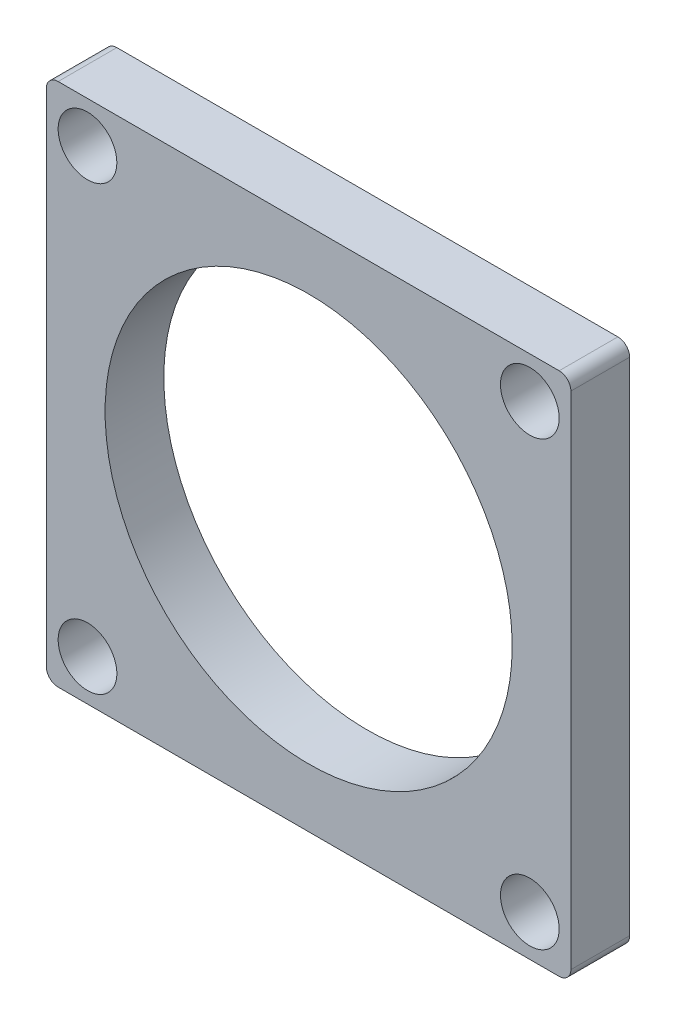
ISO-10303-21;
HEADER;
FILE_DESCRIPTION(('STEP AP214'),'2;1');
FILE_NAME('part.step','',(''),(''),'','','');
FILE_SCHEMA(('AUTOMOTIVE_DESIGN { 1 0 10303 214 1 1 1 1 }'));
ENDSEC;
DATA;
#1=APPLICATION_CONTEXT('core data for automotive mechanical design processes');
#2=APPLICATION_PROTOCOL_DEFINITION('international standard','automotive_design',2000,#1);
#3=PRODUCT_CONTEXT('',#1,'mechanical');
#4=PRODUCT('Part','Part','',(#3));
#5=PRODUCT_RELATED_PRODUCT_CATEGORY('part','',(#4));
#6=PRODUCT_DEFINITION_FORMATION('','',#4);
#7=PRODUCT_DEFINITION_CONTEXT('part definition',#1,'design');
#8=PRODUCT_DEFINITION('design','',#6,#7);
#9=PRODUCT_DEFINITION_SHAPE('','',#8);
#10=(LENGTH_UNIT() NAMED_UNIT(*) SI_UNIT(.MILLI.,.METRE.));
#11=(NAMED_UNIT(*) PLANE_ANGLE_UNIT() SI_UNIT($,.RADIAN.));
#12=(NAMED_UNIT(*) SI_UNIT($,.STERADIAN.) SOLID_ANGLE_UNIT());
#13=UNCERTAINTY_MEASURE_WITH_UNIT(LENGTH_MEASURE(1.E-05),#10,'distance_accuracy_value','');
#14=(GEOMETRIC_REPRESENTATION_CONTEXT(3) GLOBAL_UNCERTAINTY_ASSIGNED_CONTEXT((#13)) GLOBAL_UNIT_ASSIGNED_CONTEXT((#10,
#11,#12)) REPRESENTATION_CONTEXT('',''));
#15=CARTESIAN_POINT('',(0.,0.,0.));
#16=DIRECTION('',(0.,0.,1.));
#17=DIRECTION('',(1.,0.,0.));
#18=AXIS2_PLACEMENT_3D('',#15,#16,#17);
#19=CARTESIAN_POINT('',(-44.67,-44.67,10.));
#20=DIRECTION('',(0.,1.,0.));
#21=DIRECTION('',(-1.,0.,0.));
#22=AXIS2_PLACEMENT_3D('',#19,#20,#21);
#23=PLANE('',#22);
#24=DIRECTION('',(1.,0.,0.));
#25=VECTOR('',#24,1.);
#26=CARTESIAN_POINT('',(-44.67,-44.67,10.));
#27=LINE('',#26,#25);
#28=CARTESIAN_POINT('',(-42.67,-44.67,10.));
#29=VERTEX_POINT('',#28);
#30=CARTESIAN_POINT('',(42.6700000000005,-44.6699999999995,10.));
#31=VERTEX_POINT('',#30);
#32=EDGE_CURVE('E125',#29,#31,#27,.T.);
#33=ORIENTED_EDGE('',*,*,#32,.F.);
#34=DIRECTION('',(0.,0.,-1.));
#35=VECTOR('',#34,1.);
#36=CARTESIAN_POINT('',(-42.67,-44.67,0.));
#37=LINE('',#36,#35);
#38=CARTESIAN_POINT('',(-42.67,-44.67,0.));
#39=VERTEX_POINT('',#38);
#40=EDGE_CURVE('E155',#29,#39,#37,.T.);
#41=ORIENTED_EDGE('',*,*,#40,.T.);
#42=DIRECTION('',(1.,0.,0.));
#43=VECTOR('',#42,1.);
#44=CARTESIAN_POINT('',(-44.67,-44.67,0.));
#45=LINE('',#44,#43);
#46=CARTESIAN_POINT('',(42.6700000000005,-44.6699999999995,0.));
#47=VERTEX_POINT('',#46);
#48=EDGE_CURVE('E109',#39,#47,#45,.T.);
#49=ORIENTED_EDGE('',*,*,#48,.T.);
#50=DIRECTION('',(0.,0.,-1.));
#51=VECTOR('',#50,1.);
#52=CARTESIAN_POINT('',(42.6700000000006,-44.6699999999995,10.));
#53=LINE('',#52,#51);
#54=EDGE_CURVE('E153',#47,#31,#53,.F.);
#55=ORIENTED_EDGE('',*,*,#54,.T.);
#56=EDGE_LOOP('',(#33,#41,#49,#55));
#57=FACE_BOUND('',#56,.T.);
#58=ADVANCED_FACE('F38',(#57),#23,.F.);
#59=CARTESIAN_POINT('',(44.6700000000006,-44.6699999999994,10.));
#60=DIRECTION('',(-1.,0.,0.));
#61=DIRECTION('',(0.,0.,1.));
#62=AXIS2_PLACEMENT_3D('',#59,#60,#61);
#63=PLANE('',#62);
#64=DIRECTION('',(0.,1.,0.));
#65=VECTOR('',#64,1.);
#66=CARTESIAN_POINT('',(44.6700000000006,-44.6699999999994,10.));
#67=LINE('',#66,#65);
#68=CARTESIAN_POINT('',(44.6700000000006,-42.6699999999995,10.));
#69=VERTEX_POINT('',#68);
#70=CARTESIAN_POINT('',(44.6700000000006,42.6699999999995,10.));
#71=VERTEX_POINT('',#70);
#72=EDGE_CURVE('E159',#69,#71,#67,.T.);
#73=ORIENTED_EDGE('',*,*,#72,.F.);
#74=DIRECTION('',(0.,0.,-1.));
#75=VECTOR('',#74,1.);
#76=CARTESIAN_POINT('',(44.6700000000006,-42.6699999999995,10.));
#77=LINE('',#76,#75);
#78=CARTESIAN_POINT('',(44.6700000000006,-42.6699999999995,0.));
#79=VERTEX_POINT('',#78);
#80=EDGE_CURVE('E11',#69,#79,#77,.T.);
#81=ORIENTED_EDGE('',*,*,#80,.T.);
#82=DIRECTION('',(0.,1.,0.));
#83=VECTOR('',#82,1.);
#84=CARTESIAN_POINT('',(44.6700000000006,-44.6699999999994,0.));
#85=LINE('',#84,#83);
#86=CARTESIAN_POINT('',(44.6700000000006,42.6699999999995,0.));
#87=VERTEX_POINT('',#86);
#88=EDGE_CURVE('E169',#79,#87,#85,.T.);
#89=ORIENTED_EDGE('',*,*,#88,.T.);
#90=DIRECTION('',(0.,0.,-1.));
#91=VECTOR('',#90,1.);
#92=CARTESIAN_POINT('',(44.6700000000006,42.6699999999995,10.));
#93=LINE('',#92,#91);
#94=EDGE_CURVE('E46',#87,#71,#93,.F.);
#95=ORIENTED_EDGE('',*,*,#94,.T.);
#96=EDGE_LOOP('',(#73,#81,#89,#95));
#97=FACE_BOUND('',#96,.T.);
#98=ADVANCED_FACE('F192',(#97),#63,.F.);
#99=CARTESIAN_POINT('',(-44.67,44.67,10.));
#100=DIRECTION('',(0.,1.,0.));
#101=DIRECTION('',(-1.,0.,0.));
#102=AXIS2_PLACEMENT_3D('',#99,#100,#101);
#103=PLANE('',#102);
#104=DIRECTION('',(1.,0.,0.));
#105=VECTOR('',#104,1.);
#106=CARTESIAN_POINT('',(-44.67,44.67,0.));
#107=LINE('',#106,#105);
#108=CARTESIAN_POINT('',(-42.67,44.67,0.));
#109=VERTEX_POINT('',#108);
#110=CARTESIAN_POINT('',(42.6700000000005,44.6699999999995,0.));
#111=VERTEX_POINT('',#110);
#112=EDGE_CURVE('E126',#109,#111,#107,.T.);
#113=ORIENTED_EDGE('',*,*,#112,.F.);
#114=DIRECTION('',(0.,0.,-1.));
#115=VECTOR('',#114,1.);
#116=CARTESIAN_POINT('',(-42.67,44.67,10.));
#117=LINE('',#116,#115);
#118=CARTESIAN_POINT('',(-42.67,44.67,10.));
#119=VERTEX_POINT('',#118);
#120=EDGE_CURVE('E145',#109,#119,#117,.F.);
#121=ORIENTED_EDGE('',*,*,#120,.T.);
#122=DIRECTION('',(1.,0.,0.));
#123=VECTOR('',#122,1.);
#124=CARTESIAN_POINT('',(-44.67,44.67,10.));
#125=LINE('',#124,#123);
#126=CARTESIAN_POINT('',(42.6700000000005,44.6699999999995,10.));
#127=VERTEX_POINT('',#126);
#128=EDGE_CURVE('E135',#119,#127,#125,.T.);
#129=ORIENTED_EDGE('',*,*,#128,.T.);
#130=DIRECTION('',(0.,0.,-1.));
#131=VECTOR('',#130,1.);
#132=CARTESIAN_POINT('',(42.6700000000006,44.6699999999995,0.));
#133=LINE('',#132,#131);
#134=EDGE_CURVE('E142',#127,#111,#133,.T.);
#135=ORIENTED_EDGE('',*,*,#134,.T.);
#136=EDGE_LOOP('',(#113,#121,#129,#135));
#137=FACE_BOUND('',#136,.T.);
#138=ADVANCED_FACE('F176',(#137),#103,.T.);
#139=CARTESIAN_POINT('',(-44.67,-44.67,10.));
#140=DIRECTION('',(-1.,0.,0.));
#141=DIRECTION('',(0.,0.,1.));
#142=AXIS2_PLACEMENT_3D('',#139,#140,#141);
#143=PLANE('',#142);
#144=DIRECTION('',(0.,1.,0.));
#145=VECTOR('',#144,1.);
#146=CARTESIAN_POINT('',(-44.67,-44.67,10.));
#147=LINE('',#146,#145);
#148=CARTESIAN_POINT('',(-44.67,-42.67,10.));
#149=VERTEX_POINT('',#148);
#150=CARTESIAN_POINT('',(-44.67,42.67,10.));
#151=VERTEX_POINT('',#150);
#152=EDGE_CURVE('E131',#149,#151,#147,.T.);
#153=ORIENTED_EDGE('',*,*,#152,.T.);
#154=DIRECTION('',(0.,0.,-1.));
#155=VECTOR('',#154,1.);
#156=CARTESIAN_POINT('',(-44.67,42.67,10.));
#157=LINE('',#156,#155);
#158=CARTESIAN_POINT('',(-44.67,42.67,0.));
#159=VERTEX_POINT('',#158);
#160=EDGE_CURVE('E124',#151,#159,#157,.T.);
#161=ORIENTED_EDGE('',*,*,#160,.T.);
#162=DIRECTION('',(0.,1.,0.));
#163=VECTOR('',#162,1.);
#164=CARTESIAN_POINT('',(-44.67,-44.67,0.));
#165=LINE('',#164,#163);
#166=CARTESIAN_POINT('',(-44.67,-42.67,0.));
#167=VERTEX_POINT('',#166);
#168=EDGE_CURVE('E107',#167,#159,#165,.T.);
#169=ORIENTED_EDGE('',*,*,#168,.F.);
#170=DIRECTION('',(0.,0.,-1.));
#171=VECTOR('',#170,1.);
#172=CARTESIAN_POINT('',(-44.67,-42.67,10.));
#173=LINE('',#172,#171);
#174=EDGE_CURVE('E121',#167,#149,#173,.F.);
#175=ORIENTED_EDGE('',*,*,#174,.T.);
#176=EDGE_LOOP('',(#153,#161,#169,#175));
#177=FACE_BOUND('',#176,.T.);
#178=ADVANCED_FACE('F120',(#177),#143,.T.);
#179=CARTESIAN_POINT('',(0.,0.,10.));
#180=DIRECTION('',(0.,0.,1.));
#181=DIRECTION('',(1.,0.,0.));
#182=AXIS2_PLACEMENT_3D('',#179,#180,#181);
#183=PLANE('',#182);
#184=CARTESIAN_POINT('',(37.6700000000006,37.67,10.));
#185=DIRECTION('',(0.,0.,1.));
#186=DIRECTION('',(-1.,0.,0.));
#187=AXIS2_PLACEMENT_3D('',#184,#185,#186);
#188=CIRCLE('',#187,5.);
#189=CARTESIAN_POINT('',(32.6700000000006,37.67,10.));
#190=VERTEX_POINT('',#189);
#191=EDGE_CURVE('E323',#190,#190,#188,.T.);
#192=ORIENTED_EDGE('',*,*,#191,.F.);
#193=EDGE_LOOP('',(#192));
#194=FACE_BOUND('',#193,.T.);
#195=CARTESIAN_POINT('',(-37.6700000000006,37.67,10.));
#196=DIRECTION('',(0.,0.,1.));
#197=DIRECTION('',(1.,0.,0.));
#198=AXIS2_PLACEMENT_3D('',#195,#196,#197);
#199=CIRCLE('',#198,5.);
#200=CARTESIAN_POINT('',(-32.6700000000006,37.67,10.));
#201=VERTEX_POINT('',#200);
#202=EDGE_CURVE('E327',#201,#201,#199,.T.);
#203=ORIENTED_EDGE('',*,*,#202,.F.);
#204=EDGE_LOOP('',(#203));
#205=FACE_BOUND('',#204,.T.);
#206=CARTESIAN_POINT('',(-37.6700000000006,-37.67,10.));
#207=DIRECTION('',(0.,0.,1.));
#208=DIRECTION('',(-1.,0.,0.));
#209=AXIS2_PLACEMENT_3D('',#206,#207,#208);
#210=CIRCLE('',#209,5.);
#211=CARTESIAN_POINT('',(-42.6700000000006,-37.67,10.));
#212=VERTEX_POINT('',#211);
#213=EDGE_CURVE('E331',#212,#212,#210,.T.);
#214=ORIENTED_EDGE('',*,*,#213,.F.);
#215=EDGE_LOOP('',(#214));
#216=FACE_BOUND('',#215,.T.);
#217=CARTESIAN_POINT('',(37.6700000000006,-37.67,10.));
#218=DIRECTION('',(0.,0.,1.));
#219=DIRECTION('',(1.,0.,0.));
#220=AXIS2_PLACEMENT_3D('',#217,#218,#219);
#221=CIRCLE('',#220,5.);
#222=CARTESIAN_POINT('',(42.6700000000006,-37.67,10.));
#223=VERTEX_POINT('',#222);
#224=EDGE_CURVE('E335',#223,#223,#221,.T.);
#225=ORIENTED_EDGE('',*,*,#224,.F.);
#226=EDGE_LOOP('',(#225));
#227=FACE_BOUND('',#226,.T.);
#228=CARTESIAN_POINT('',(0.,0.,10.));
#229=DIRECTION('',(0.,0.,1.));
#230=DIRECTION('',(1.,0.,0.));
#231=AXIS2_PLACEMENT_3D('',#228,#229,#230);
#232=CIRCLE('',#231,34.67);
#233=CARTESIAN_POINT('',(34.67,0.,10.));
#234=VERTEX_POINT('',#233);
#235=EDGE_CURVE('E163',#234,#234,#232,.T.);
#236=ORIENTED_EDGE('',*,*,#235,.F.);
#237=EDGE_LOOP('',(#236));
#238=FACE_BOUND('',#237,.T.);
#239=ORIENTED_EDGE('',*,*,#128,.F.);
#240=CARTESIAN_POINT('',(-42.67,42.67,10.));
#241=DIRECTION('',(0.,0.,1.));
#242=DIRECTION('',(1.,0.,0.));
#243=AXIS2_PLACEMENT_3D('',#240,#241,#242);
#244=CIRCLE('',#243,2.);
#245=EDGE_CURVE('E151',#119,#151,#244,.T.);
#246=ORIENTED_EDGE('',*,*,#245,.T.);
#247=ORIENTED_EDGE('',*,*,#152,.F.);
#248=CARTESIAN_POINT('',(-42.67,-42.67,10.));
#249=DIRECTION('',(0.,0.,1.));
#250=DIRECTION('',(1.,0.,0.));
#251=AXIS2_PLACEMENT_3D('',#248,#249,#250);
#252=CIRCLE('',#251,2.);
#253=EDGE_CURVE('E130',#149,#29,#252,.T.);
#254=ORIENTED_EDGE('',*,*,#253,.T.);
#255=ORIENTED_EDGE('',*,*,#32,.T.);
#256=CARTESIAN_POINT('',(42.6700000000006,-42.6699999999995,10.));
#257=DIRECTION('',(0.,0.,1.));
#258=DIRECTION('',(1.,0.,0.));
#259=AXIS2_PLACEMENT_3D('',#256,#257,#258);
#260=CIRCLE('',#259,2.);
#261=EDGE_CURVE('E59',#31,#69,#260,.T.);
#262=ORIENTED_EDGE('',*,*,#261,.T.);
#263=ORIENTED_EDGE('',*,*,#72,.T.);
#264=CARTESIAN_POINT('',(42.6700000000006,42.6699999999995,10.));
#265=DIRECTION('',(0.,0.,1.));
#266=DIRECTION('',(1.,0.,0.));
#267=AXIS2_PLACEMENT_3D('',#264,#265,#266);
#268=CIRCLE('',#267,2.);
#269=EDGE_CURVE('E147',#71,#127,#268,.T.);
#270=ORIENTED_EDGE('',*,*,#269,.T.);
#271=EDGE_LOOP('',(#239,#246,#247,#254,#255,#262,#263,#270));
#272=FACE_BOUND('',#271,.T.);
#273=ADVANCED_FACE('F182',(#194,#205,#216,#227,#238,#272),#183,.T.);
#274=CARTESIAN_POINT('',(0.,0.,0.));
#275=DIRECTION('',(0.,0.,1.));
#276=DIRECTION('',(1.,0.,0.));
#277=AXIS2_PLACEMENT_3D('',#274,#275,#276);
#278=PLANE('',#277);
#279=CARTESIAN_POINT('',(37.6700000000006,37.67,0.));
#280=DIRECTION('',(0.,0.,1.));
#281=DIRECTION('',(-1.,0.,0.));
#282=AXIS2_PLACEMENT_3D('',#279,#280,#281);
#283=CIRCLE('',#282,5.);
#284=CARTESIAN_POINT('',(32.6700000000006,37.67,0.));
#285=VERTEX_POINT('',#284);
#286=EDGE_CURVE('E349',#285,#285,#283,.T.);
#287=ORIENTED_EDGE('',*,*,#286,.T.);
#288=EDGE_LOOP('',(#287));
#289=FACE_BOUND('',#288,.T.);
#290=CARTESIAN_POINT('',(-37.6700000000006,37.67,0.));
#291=DIRECTION('',(0.,0.,1.));
#292=DIRECTION('',(1.,0.,0.));
#293=AXIS2_PLACEMENT_3D('',#290,#291,#292);
#294=CIRCLE('',#293,5.);
#295=CARTESIAN_POINT('',(-32.6700000000006,37.67,0.));
#296=VERTEX_POINT('',#295);
#297=EDGE_CURVE('E353',#296,#296,#294,.T.);
#298=ORIENTED_EDGE('',*,*,#297,.T.);
#299=EDGE_LOOP('',(#298));
#300=FACE_BOUND('',#299,.T.);
#301=CARTESIAN_POINT('',(-37.6700000000006,-37.67,0.));
#302=DIRECTION('',(0.,0.,1.));
#303=DIRECTION('',(-1.,0.,0.));
#304=AXIS2_PLACEMENT_3D('',#301,#302,#303);
#305=CIRCLE('',#304,5.);
#306=CARTESIAN_POINT('',(-42.6700000000006,-37.67,0.));
#307=VERTEX_POINT('',#306);
#308=EDGE_CURVE('E345',#307,#307,#305,.T.);
#309=ORIENTED_EDGE('',*,*,#308,.T.);
#310=EDGE_LOOP('',(#309));
#311=FACE_BOUND('',#310,.T.);
#312=CARTESIAN_POINT('',(37.6700000000006,-37.67,0.));
#313=DIRECTION('',(0.,0.,1.));
#314=DIRECTION('',(1.,0.,0.));
#315=AXIS2_PLACEMENT_3D('',#312,#313,#314);
#316=CIRCLE('',#315,5.);
#317=CARTESIAN_POINT('',(42.6700000000006,-37.67,0.));
#318=VERTEX_POINT('',#317);
#319=EDGE_CURVE('E339',#318,#318,#316,.T.);
#320=ORIENTED_EDGE('',*,*,#319,.T.);
#321=EDGE_LOOP('',(#320));
#322=FACE_BOUND('',#321,.T.);
#323=CARTESIAN_POINT('',(0.,0.,0.));
#324=DIRECTION('',(0.,0.,1.));
#325=DIRECTION('',(1.,0.,0.));
#326=AXIS2_PLACEMENT_3D('',#323,#324,#325);
#327=CIRCLE('',#326,34.67);
#328=CARTESIAN_POINT('',(34.67,0.,0.));
#329=VERTEX_POINT('',#328);
#330=EDGE_CURVE('E170',#329,#329,#327,.T.);
#331=ORIENTED_EDGE('',*,*,#330,.T.);
#332=EDGE_LOOP('',(#331));
#333=FACE_BOUND('',#332,.T.);
#334=ORIENTED_EDGE('',*,*,#168,.T.);
#335=CARTESIAN_POINT('',(-42.67,42.67,0.));
#336=DIRECTION('',(0.,0.,1.));
#337=DIRECTION('',(1.,0.,0.));
#338=AXIS2_PLACEMENT_3D('',#335,#336,#337);
#339=CIRCLE('',#338,2.);
#340=EDGE_CURVE('E114',#159,#109,#339,.F.);
#341=ORIENTED_EDGE('',*,*,#340,.T.);
#342=ORIENTED_EDGE('',*,*,#112,.T.);
#343=CARTESIAN_POINT('',(42.6700000000006,42.6699999999995,0.));
#344=DIRECTION('',(0.,0.,1.));
#345=DIRECTION('',(1.,0.,0.));
#346=AXIS2_PLACEMENT_3D('',#343,#344,#345);
#347=CIRCLE('',#346,2.);
#348=EDGE_CURVE('E133',#111,#87,#347,.F.);
#349=ORIENTED_EDGE('',*,*,#348,.T.);
#350=ORIENTED_EDGE('',*,*,#88,.F.);
#351=CARTESIAN_POINT('',(42.6700000000006,-42.6699999999995,0.));
#352=DIRECTION('',(0.,0.,1.));
#353=DIRECTION('',(1.,0.,0.));
#354=AXIS2_PLACEMENT_3D('',#351,#352,#353);
#355=CIRCLE('',#354,2.);
#356=EDGE_CURVE('E115',#79,#47,#355,.F.);
#357=ORIENTED_EDGE('',*,*,#356,.T.);
#358=ORIENTED_EDGE('',*,*,#48,.F.);
#359=CARTESIAN_POINT('',(-42.67,-42.67,0.));
#360=DIRECTION('',(0.,0.,1.));
#361=DIRECTION('',(1.,0.,0.));
#362=AXIS2_PLACEMENT_3D('',#359,#360,#361);
#363=CIRCLE('',#362,2.);
#364=EDGE_CURVE('E104',#39,#167,#363,.F.);
#365=ORIENTED_EDGE('',*,*,#364,.T.);
#366=EDGE_LOOP('',(#334,#341,#342,#349,#350,#357,#358,#365));
#367=FACE_BOUND('',#366,.T.);
#368=ADVANCED_FACE('F106',(#289,#300,#311,#322,#333,#367),#278,.F.);
#369=CARTESIAN_POINT('',(0.,0.,0.));
#370=DIRECTION('',(0.,0.,1.));
#371=DIRECTION('',(1.,0.,0.));
#372=AXIS2_PLACEMENT_3D('',#369,#370,#371);
#373=CYLINDRICAL_SURFACE('',#372,34.67);
#374=ORIENTED_EDGE('',*,*,#330,.F.);
#375=EDGE_LOOP('',(#374));
#376=FACE_BOUND('',#375,.T.);
#377=ORIENTED_EDGE('',*,*,#235,.T.);
#378=EDGE_LOOP('',(#377));
#379=FACE_BOUND('',#378,.T.);
#380=ADVANCED_FACE('F260',(#376,#379),#373,.F.);
#381=CARTESIAN_POINT('',(37.6700000000006,-37.67,0.));
#382=DIRECTION('',(0.,0.,1.));
#383=DIRECTION('',(1.,0.,0.));
#384=AXIS2_PLACEMENT_3D('',#381,#382,#383);
#385=CYLINDRICAL_SURFACE('',#384,5.);
#386=ORIENTED_EDGE('',*,*,#319,.F.);
#387=EDGE_LOOP('',(#386));
#388=FACE_BOUND('',#387,.T.);
#389=ORIENTED_EDGE('',*,*,#224,.T.);
#390=EDGE_LOOP('',(#389));
#391=FACE_BOUND('',#390,.T.);
#392=ADVANCED_FACE('F251',(#388,#391),#385,.F.);
#393=CARTESIAN_POINT('',(-37.6700000000006,-37.67,0.));
#394=DIRECTION('',(0.,0.,1.));
#395=DIRECTION('',(1.,0.,0.));
#396=AXIS2_PLACEMENT_3D('',#393,#394,#395);
#397=CYLINDRICAL_SURFACE('',#396,5.);
#398=ORIENTED_EDGE('',*,*,#308,.F.);
#399=EDGE_LOOP('',(#398));
#400=FACE_BOUND('',#399,.T.);
#401=ORIENTED_EDGE('',*,*,#213,.T.);
#402=EDGE_LOOP('',(#401));
#403=FACE_BOUND('',#402,.T.);
#404=ADVANCED_FACE('F242',(#400,#403),#397,.F.);
#405=CARTESIAN_POINT('',(-37.6700000000006,37.67,0.));
#406=DIRECTION('',(0.,0.,1.));
#407=DIRECTION('',(1.,0.,0.));
#408=AXIS2_PLACEMENT_3D('',#405,#406,#407);
#409=CYLINDRICAL_SURFACE('',#408,5.);
#410=ORIENTED_EDGE('',*,*,#297,.F.);
#411=EDGE_LOOP('',(#410));
#412=FACE_BOUND('',#411,.T.);
#413=ORIENTED_EDGE('',*,*,#202,.T.);
#414=EDGE_LOOP('',(#413));
#415=FACE_BOUND('',#414,.T.);
#416=ADVANCED_FACE('F233',(#412,#415),#409,.F.);
#417=CARTESIAN_POINT('',(37.6700000000006,37.67,0.));
#418=DIRECTION('',(0.,0.,1.));
#419=DIRECTION('',(1.,0.,0.));
#420=AXIS2_PLACEMENT_3D('',#417,#418,#419);
#421=CYLINDRICAL_SURFACE('',#420,5.);
#422=ORIENTED_EDGE('',*,*,#286,.F.);
#423=EDGE_LOOP('',(#422));
#424=FACE_BOUND('',#423,.T.);
#425=ORIENTED_EDGE('',*,*,#191,.T.);
#426=EDGE_LOOP('',(#425));
#427=FACE_BOUND('',#426,.T.);
#428=ADVANCED_FACE('F202',(#424,#427),#421,.F.);
#429=CARTESIAN_POINT('',(-42.67,42.67,10.));
#430=DIRECTION('',(0.,0.,-1.));
#431=DIRECTION('',(-1.,0.,0.));
#432=AXIS2_PLACEMENT_3D('',#429,#430,#431);
#433=CYLINDRICAL_SURFACE('',#432,2.);
#434=ORIENTED_EDGE('',*,*,#245,.F.);
#435=ORIENTED_EDGE('',*,*,#120,.F.);
#436=ORIENTED_EDGE('',*,*,#340,.F.);
#437=ORIENTED_EDGE('',*,*,#160,.F.);
#438=EDGE_LOOP('',(#434,#435,#436,#437));
#439=FACE_BOUND('',#438,.T.);
#440=ADVANCED_FACE('F181',(#439),#433,.T.);
#441=CARTESIAN_POINT('',(-42.67,-42.67,10.));
#442=DIRECTION('',(0.,0.,1.));
#443=DIRECTION('',(1.,0.,0.));
#444=AXIS2_PLACEMENT_3D('',#441,#442,#443);
#445=CYLINDRICAL_SURFACE('',#444,2.);
#446=ORIENTED_EDGE('',*,*,#253,.F.);
#447=ORIENTED_EDGE('',*,*,#174,.F.);
#448=ORIENTED_EDGE('',*,*,#364,.F.);
#449=ORIENTED_EDGE('',*,*,#40,.F.);
#450=EDGE_LOOP('',(#446,#447,#448,#449));
#451=FACE_BOUND('',#450,.T.);
#452=ADVANCED_FACE('F129',(#451),#445,.T.);
#453=CARTESIAN_POINT('',(42.6700000000006,-42.6699999999995,10.));
#454=DIRECTION('',(0.,0.,-1.));
#455=DIRECTION('',(-1.,0.,0.));
#456=AXIS2_PLACEMENT_3D('',#453,#454,#455);
#457=CYLINDRICAL_SURFACE('',#456,2.);
#458=ORIENTED_EDGE('',*,*,#261,.F.);
#459=ORIENTED_EDGE('',*,*,#54,.F.);
#460=ORIENTED_EDGE('',*,*,#356,.F.);
#461=ORIENTED_EDGE('',*,*,#80,.F.);
#462=EDGE_LOOP('',(#458,#459,#460,#461));
#463=FACE_BOUND('',#462,.T.);
#464=ADVANCED_FACE('F186',(#463),#457,.T.);
#465=CARTESIAN_POINT('',(42.6700000000006,42.6699999999995,10.));
#466=DIRECTION('',(0.,0.,1.));
#467=DIRECTION('',(1.,0.,0.));
#468=AXIS2_PLACEMENT_3D('',#465,#466,#467);
#469=CYLINDRICAL_SURFACE('',#468,2.);
#470=ORIENTED_EDGE('',*,*,#269,.F.);
#471=ORIENTED_EDGE('',*,*,#94,.F.);
#472=ORIENTED_EDGE('',*,*,#348,.F.);
#473=ORIENTED_EDGE('',*,*,#134,.F.);
#474=EDGE_LOOP('',(#470,#471,#472,#473));
#475=FACE_BOUND('',#474,.T.);
#476=ADVANCED_FACE('F40',(#475),#469,.T.);
#477=CLOSED_SHELL('',(#58,#98,#138,#178,#273,#368,#380,#392,#404,#416,#428,#440,#452,#464,#476));
#478=MANIFOLD_SOLID_BREP('B2',#477);
#479=ADVANCED_BREP_SHAPE_REPRESENTATION('',(#18,#478),#14);
#480=SHAPE_DEFINITION_REPRESENTATION(#9,#479);
ENDSEC;
END-ISO-10303-21;
